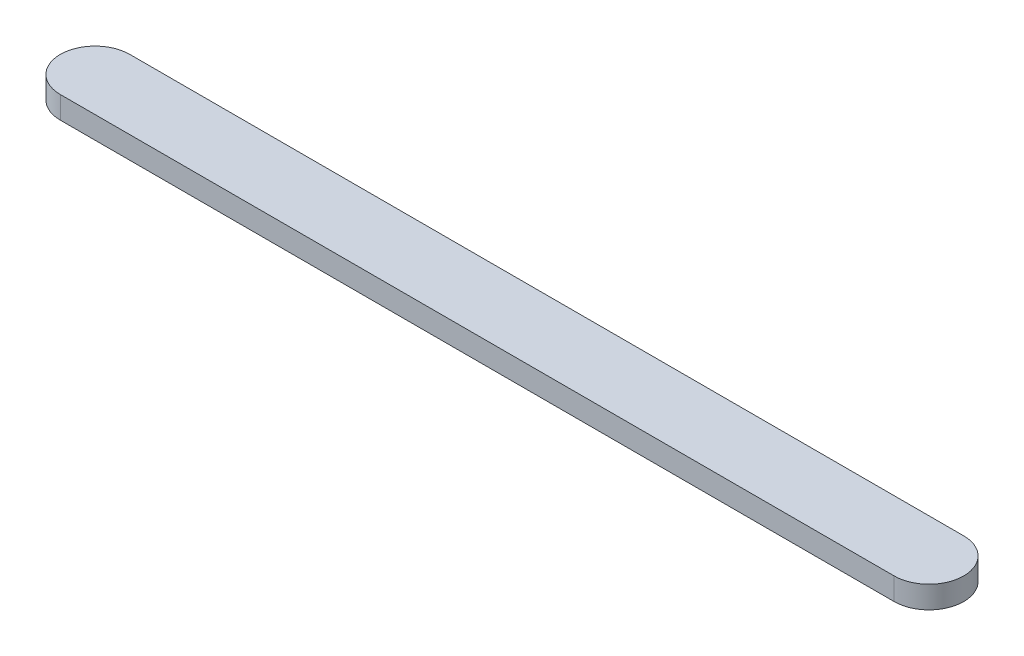
ISO-10303-21;
HEADER;
FILE_DESCRIPTION(('STEP AP214'),'2;1');
FILE_NAME('part.step','',(''),(''),'','','');
FILE_SCHEMA(('AUTOMOTIVE_DESIGN { 1 0 10303 214 1 1 1 1 }'));
ENDSEC;
DATA;
#1=APPLICATION_CONTEXT('core data for automotive mechanical design processes');
#2=APPLICATION_PROTOCOL_DEFINITION('international standard','automotive_design',2000,#1);
#3=PRODUCT_CONTEXT('',#1,'mechanical');
#4=PRODUCT('Part','Part','',(#3));
#5=PRODUCT_RELATED_PRODUCT_CATEGORY('part','',(#4));
#6=PRODUCT_DEFINITION_FORMATION('','',#4);
#7=PRODUCT_DEFINITION_CONTEXT('part definition',#1,'design');
#8=PRODUCT_DEFINITION('design','',#6,#7);
#9=PRODUCT_DEFINITION_SHAPE('','',#8);
#10=(LENGTH_UNIT() NAMED_UNIT(*) SI_UNIT(.MILLI.,.METRE.));
#11=(NAMED_UNIT(*) PLANE_ANGLE_UNIT() SI_UNIT($,.RADIAN.));
#12=(NAMED_UNIT(*) SI_UNIT($,.STERADIAN.) SOLID_ANGLE_UNIT());
#13=UNCERTAINTY_MEASURE_WITH_UNIT(LENGTH_MEASURE(1.E-05),#10,'distance_accuracy_value','');
#14=(GEOMETRIC_REPRESENTATION_CONTEXT(3) GLOBAL_UNCERTAINTY_ASSIGNED_CONTEXT((#13)) GLOBAL_UNIT_ASSIGNED_CONTEXT((#10,
#11,#12)) REPRESENTATION_CONTEXT('',''));
#15=CARTESIAN_POINT('',(0.,0.,0.));
#16=DIRECTION('',(0.,0.,1.));
#17=DIRECTION('',(1.,0.,0.));
#18=AXIS2_PLACEMENT_3D('',#15,#16,#17);
#19=CARTESIAN_POINT('',(-39.6792231491137,2.032,0.));
#20=DIRECTION('',(0.,-1.,0.));
#21=DIRECTION('',(0.,0.,-1.));
#22=AXIS2_PLACEMENT_3D('',#19,#20,#21);
#23=CYLINDRICAL_SURFACE('',#22,3.175);
#24=CARTESIAN_POINT('',(-39.6792231491137,0.,0.));
#25=DIRECTION('',(0.,1.,0.));
#26=DIRECTION('',(0.,0.,1.));
#27=AXIS2_PLACEMENT_3D('',#24,#25,#26);
#28=CIRCLE('',#27,3.175);
#29=CARTESIAN_POINT('',(-39.6792231491137,0.,-3.175));
#30=VERTEX_POINT('',#29);
#31=CARTESIAN_POINT('',(-39.6792231491137,0.,3.175));
#32=VERTEX_POINT('',#31);
#33=EDGE_CURVE('E96',#30,#32,#28,.T.);
#34=ORIENTED_EDGE('',*,*,#33,.T.);
#35=DIRECTION('',(0.,-1.,0.));
#36=VECTOR('',#35,1.);
#37=CARTESIAN_POINT('',(-39.6792231491137,2.032,3.175));
#38=LINE('',#37,#36);
#39=CARTESIAN_POINT('',(-39.6792231491137,2.032,3.175));
#40=VERTEX_POINT('',#39);
#41=EDGE_CURVE('E11',#40,#32,#38,.T.);
#42=ORIENTED_EDGE('',*,*,#41,.F.);
#43=CARTESIAN_POINT('',(-39.6792231491137,2.032,0.));
#44=DIRECTION('',(0.,1.,0.));
#45=DIRECTION('',(0.,0.,1.));
#46=AXIS2_PLACEMENT_3D('',#43,#44,#45);
#47=CIRCLE('',#46,3.175);
#48=CARTESIAN_POINT('',(-39.6792231491137,2.032,-3.175));
#49=VERTEX_POINT('',#48);
#50=EDGE_CURVE('E84',#49,#40,#47,.T.);
#51=ORIENTED_EDGE('',*,*,#50,.F.);
#52=DIRECTION('',(0.,-1.,0.));
#53=VECTOR('',#52,1.);
#54=CARTESIAN_POINT('',(-39.6792231491137,2.032,-3.175));
#55=LINE('',#54,#53);
#56=EDGE_CURVE('E92',#49,#30,#55,.T.);
#57=ORIENTED_EDGE('',*,*,#56,.T.);
#58=EDGE_LOOP('',(#34,#42,#51,#57));
#59=FACE_BOUND('',#58,.T.);
#60=ADVANCED_FACE('F33',(#59),#23,.T.);
#61=CARTESIAN_POINT('',(-39.6792231491137,2.032,3.175));
#62=DIRECTION('',(0.,0.,-1.));
#63=DIRECTION('',(-1.,0.,0.));
#64=AXIS2_PLACEMENT_3D('',#61,#62,#63);
#65=PLANE('',#64);
#66=DIRECTION('',(1.,0.,0.));
#67=VECTOR('',#66,1.);
#68=CARTESIAN_POINT('',(-39.6792231491137,0.,3.175));
#69=LINE('',#68,#67);
#70=CARTESIAN_POINT('',(36.5207768508863,0.,3.175));
#71=VERTEX_POINT('',#70);
#72=EDGE_CURVE('E88',#32,#71,#69,.T.);
#73=ORIENTED_EDGE('',*,*,#72,.T.);
#74=DIRECTION('',(0.,-1.,0.));
#75=VECTOR('',#74,1.);
#76=CARTESIAN_POINT('',(36.5207768508863,2.032,3.175));
#77=LINE('',#76,#75);
#78=CARTESIAN_POINT('',(36.5207768508863,2.032,3.175));
#79=VERTEX_POINT('',#78);
#80=EDGE_CURVE('E41',#79,#71,#77,.T.);
#81=ORIENTED_EDGE('',*,*,#80,.F.);
#82=DIRECTION('',(1.,0.,0.));
#83=VECTOR('',#82,1.);
#84=CARTESIAN_POINT('',(-39.6792231491137,2.032,3.175));
#85=LINE('',#84,#83);
#86=EDGE_CURVE('E79',#40,#79,#85,.T.);
#87=ORIENTED_EDGE('',*,*,#86,.F.);
#88=ORIENTED_EDGE('',*,*,#41,.T.);
#89=EDGE_LOOP('',(#73,#81,#87,#88));
#90=FACE_BOUND('',#89,.T.);
#91=ADVANCED_FACE('F87',(#90),#65,.F.);
#92=CARTESIAN_POINT('',(36.5207768508863,2.032,0.));
#93=DIRECTION('',(0.,-1.,0.));
#94=DIRECTION('',(0.,0.,-1.));
#95=AXIS2_PLACEMENT_3D('',#92,#93,#94);
#96=CYLINDRICAL_SURFACE('',#95,3.175);
#97=CARTESIAN_POINT('',(36.5207768508863,0.,0.));
#98=DIRECTION('',(0.,1.,0.));
#99=DIRECTION('',(0.,0.,1.));
#100=AXIS2_PLACEMENT_3D('',#97,#98,#99);
#101=CIRCLE('',#100,3.175);
#102=CARTESIAN_POINT('',(36.5207768508863,0.,-3.175));
#103=VERTEX_POINT('',#102);
#104=EDGE_CURVE('E66',#71,#103,#101,.T.);
#105=ORIENTED_EDGE('',*,*,#104,.T.);
#106=DIRECTION('',(0.,-1.,0.));
#107=VECTOR('',#106,1.);
#108=CARTESIAN_POINT('',(36.5207768508863,2.032,-3.175));
#109=LINE('',#108,#107);
#110=CARTESIAN_POINT('',(36.5207768508863,2.032,-3.175));
#111=VERTEX_POINT('',#110);
#112=EDGE_CURVE('E89',#111,#103,#109,.T.);
#113=ORIENTED_EDGE('',*,*,#112,.F.);
#114=CARTESIAN_POINT('',(36.5207768508863,2.032,0.));
#115=DIRECTION('',(0.,1.,0.));
#116=DIRECTION('',(0.,0.,1.));
#117=AXIS2_PLACEMENT_3D('',#114,#115,#116);
#118=CIRCLE('',#117,3.175);
#119=EDGE_CURVE('E82',#79,#111,#118,.T.);
#120=ORIENTED_EDGE('',*,*,#119,.F.);
#121=ORIENTED_EDGE('',*,*,#80,.T.);
#122=EDGE_LOOP('',(#105,#113,#120,#121));
#123=FACE_BOUND('',#122,.T.);
#124=ADVANCED_FACE('F90',(#123),#96,.T.);
#125=CARTESIAN_POINT('',(-39.6792231491137,2.032,-3.175));
#126=DIRECTION('',(0.,0.,1.));
#127=DIRECTION('',(1.,0.,0.));
#128=AXIS2_PLACEMENT_3D('',#125,#126,#127);
#129=PLANE('',#128);
#130=DIRECTION('',(-1.,0.,0.));
#131=VECTOR('',#130,1.);
#132=CARTESIAN_POINT('',(-39.6792231491137,0.,-3.175));
#133=LINE('',#132,#131);
#134=EDGE_CURVE('E72',#103,#30,#133,.T.);
#135=ORIENTED_EDGE('',*,*,#134,.T.);
#136=ORIENTED_EDGE('',*,*,#56,.F.);
#137=DIRECTION('',(-1.,0.,0.));
#138=VECTOR('',#137,1.);
#139=CARTESIAN_POINT('',(-39.6792231491137,2.032,-3.175));
#140=LINE('',#139,#138);
#141=EDGE_CURVE('E49',#111,#49,#140,.T.);
#142=ORIENTED_EDGE('',*,*,#141,.F.);
#143=ORIENTED_EDGE('',*,*,#112,.T.);
#144=EDGE_LOOP('',(#135,#136,#142,#143));
#145=FACE_BOUND('',#144,.T.);
#146=ADVANCED_FACE('F103',(#145),#129,.F.);
#147=CARTESIAN_POINT('',(-39.6792231491137,2.032,0.));
#148=DIRECTION('',(0.,1.,0.));
#149=DIRECTION('',(0.,0.,1.));
#150=AXIS2_PLACEMENT_3D('',#147,#148,#149);
#151=PLANE('',#150);
#152=ORIENTED_EDGE('',*,*,#50,.T.);
#153=ORIENTED_EDGE('',*,*,#86,.T.);
#154=ORIENTED_EDGE('',*,*,#119,.T.);
#155=ORIENTED_EDGE('',*,*,#141,.T.);
#156=EDGE_LOOP('',(#152,#153,#154,#155));
#157=FACE_BOUND('',#156,.T.);
#158=ADVANCED_FACE('F80',(#157),#151,.T.);
#159=CARTESIAN_POINT('',(-39.6792231491137,0.,0.));
#160=DIRECTION('',(0.,1.,0.));
#161=DIRECTION('',(0.,0.,1.));
#162=AXIS2_PLACEMENT_3D('',#159,#160,#161);
#163=PLANE('',#162);
#164=ORIENTED_EDGE('',*,*,#33,.F.);
#165=ORIENTED_EDGE('',*,*,#134,.F.);
#166=ORIENTED_EDGE('',*,*,#104,.F.);
#167=ORIENTED_EDGE('',*,*,#72,.F.);
#168=EDGE_LOOP('',(#164,#165,#166,#167));
#169=FACE_BOUND('',#168,.T.);
#170=ADVANCED_FACE('F106',(#169),#163,.F.);
#171=CLOSED_SHELL('',(#60,#91,#124,#146,#158,#170));
#172=MANIFOLD_SOLID_BREP('B2',#171);
#173=ADVANCED_BREP_SHAPE_REPRESENTATION('',(#18,#172),#14);
#174=SHAPE_DEFINITION_REPRESENTATION(#9,#173);
ENDSEC;
END-ISO-10303-21;
